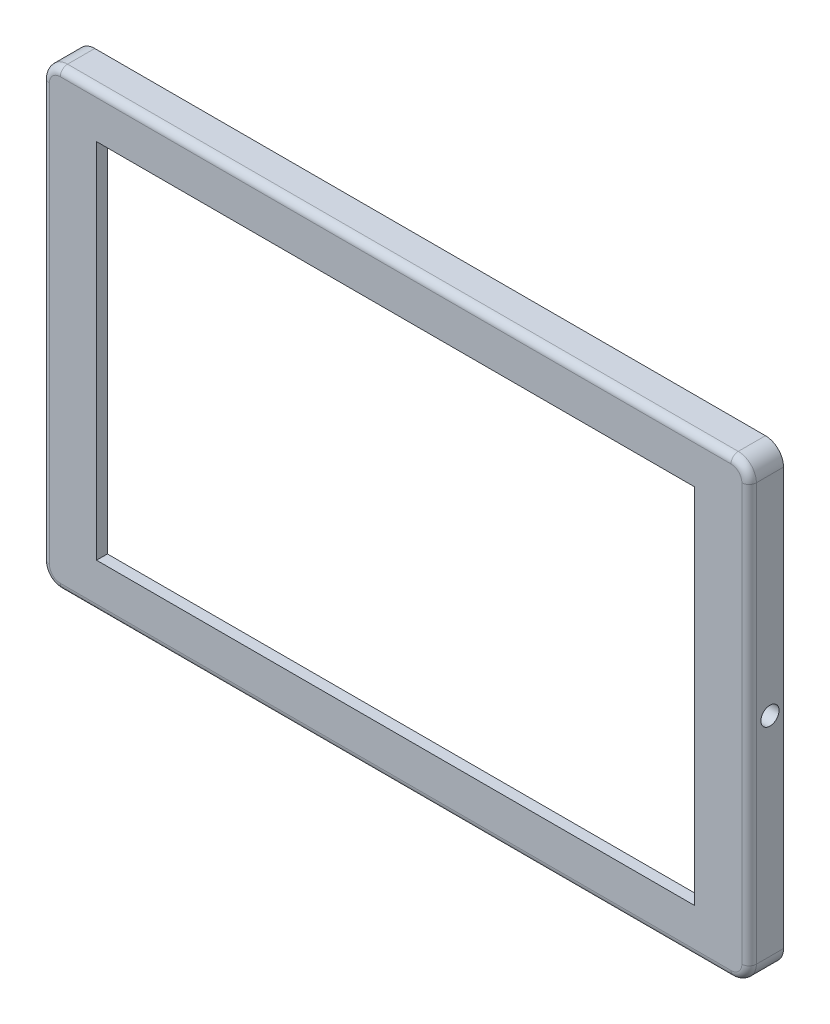
ISO-10303-21;
HEADER;
FILE_DESCRIPTION(('STEP AP214'),'2;1');
FILE_NAME('part.step','',(''),(''),'','','');
FILE_SCHEMA(('AUTOMOTIVE_DESIGN { 1 0 10303 214 1 1 1 1 }'));
ENDSEC;
DATA;
#1=APPLICATION_CONTEXT('core data for automotive mechanical design processes');
#2=APPLICATION_PROTOCOL_DEFINITION('international standard','automotive_design',2000,#1);
#3=PRODUCT_CONTEXT('',#1,'mechanical');
#4=PRODUCT('Part','Part','',(#3));
#5=PRODUCT_RELATED_PRODUCT_CATEGORY('part','',(#4));
#6=PRODUCT_DEFINITION_FORMATION('','',#4);
#7=PRODUCT_DEFINITION_CONTEXT('part definition',#1,'design');
#8=PRODUCT_DEFINITION('design','',#6,#7);
#9=PRODUCT_DEFINITION_SHAPE('','',#8);
#10=(LENGTH_UNIT() NAMED_UNIT(*) SI_UNIT(.MILLI.,.METRE.));
#11=(NAMED_UNIT(*) PLANE_ANGLE_UNIT() SI_UNIT($,.RADIAN.));
#12=(NAMED_UNIT(*) SI_UNIT($,.STERADIAN.) SOLID_ANGLE_UNIT());
#13=UNCERTAINTY_MEASURE_WITH_UNIT(LENGTH_MEASURE(1.E-05),#10,'distance_accuracy_value','');
#14=(GEOMETRIC_REPRESENTATION_CONTEXT(3) GLOBAL_UNCERTAINTY_ASSIGNED_CONTEXT((#13)) GLOBAL_UNIT_ASSIGNED_CONTEXT((#10,
#11,#12)) REPRESENTATION_CONTEXT('',''));
#15=CARTESIAN_POINT('',(0.,0.,0.));
#16=DIRECTION('',(0.,0.,1.));
#17=DIRECTION('',(1.,0.,0.));
#18=AXIS2_PLACEMENT_3D('',#15,#16,#17);
#19=CARTESIAN_POINT('',(-92.5000000000001,57.4999999999997,9.49999999999929));
#20=DIRECTION('',(1.,0.,0.));
#21=DIRECTION('',(0.,1.,0.));
#22=AXIS2_PLACEMENT_3D('',#19,#20,#21);
#23=PLANE('',#22);
#24=CARTESIAN_POINT('',(-92.5,-2.35922392732846E-13,3.74999999999936));
#25=DIRECTION('',(1.,0.,0.));
#26=DIRECTION('',(0.,1.,0.));
#27=AXIS2_PLACEMENT_3D('',#24,#25,#26);
#28=CIRCLE('',#27,2.5);
#29=CARTESIAN_POINT('',(-92.4999999999999,-2.50000000000023,3.75000000000015));
#30=VERTEX_POINT('',#29);
#31=EDGE_CURVE('E208',#30,#30,#28,.T.);
#32=ORIENTED_EDGE('',*,*,#31,.F.);
#33=EDGE_LOOP('',(#32));
#34=FACE_BOUND('',#33,.T.);
#35=DIRECTION('',(0.,0.,-1.));
#36=VECTOR('',#35,1.);
#37=CARTESIAN_POINT('',(-92.5000000000001,57.4999999999997,9.49999999999929));
#38=LINE('',#37,#36);
#39=CARTESIAN_POINT('',(-92.5000000000001,57.4999999999997,6.50000000000006));
#40=VERTEX_POINT('',#39);
#41=CARTESIAN_POINT('',(-92.4999999999999,57.4999999999997,0.));
#42=VERTEX_POINT('',#41);
#43=EDGE_CURVE('E244',#40,#42,#38,.T.);
#44=ORIENTED_EDGE('',*,*,#43,.F.);
#45=DIRECTION('',(0.,-1.,0.));
#46=VECTOR('',#45,1.);
#47=CARTESIAN_POINT('',(-92.5000000000001,57.4999999999997,6.50000000000006));
#48=LINE('',#47,#46);
#49=CARTESIAN_POINT('',(-92.5,-57.5000000000003,6.49999999999962));
#50=VERTEX_POINT('',#49);
#51=EDGE_CURVE('E229',#40,#50,#48,.T.);
#52=ORIENTED_EDGE('',*,*,#51,.T.);
#53=DIRECTION('',(0.,0.,-1.));
#54=VECTOR('',#53,1.);
#55=CARTESIAN_POINT('',(-92.5000000000001,-57.5000000000003,9.50000000000023));
#56=LINE('',#55,#54);
#57=CARTESIAN_POINT('',(-92.5000000000001,-57.5000000000004,-7.7715611723761E-13));
#58=VERTEX_POINT('',#57);
#59=EDGE_CURVE('E250',#50,#58,#56,.T.);
#60=ORIENTED_EDGE('',*,*,#59,.T.);
#61=DIRECTION('',(0.,-1.,0.));
#62=VECTOR('',#61,1.);
#63=CARTESIAN_POINT('',(-92.4999999999999,57.4999999999997,0.));
#64=LINE('',#63,#62);
#65=EDGE_CURVE('E232',#42,#58,#64,.T.);
#66=ORIENTED_EDGE('',*,*,#65,.F.);
#67=EDGE_LOOP('',(#44,#52,#60,#66));
#68=FACE_BOUND('',#67,.T.);
#69=ADVANCED_FACE('F39',(#34,#68),#23,.T.);
#70=CARTESIAN_POINT('',(-92.5000000000001,-57.5000000000003,9.50000000000023));
#71=DIRECTION('',(0.,1.,0.));
#72=DIRECTION('',(0.,0.,1.));
#73=AXIS2_PLACEMENT_3D('',#70,#71,#72);
#74=PLANE('',#73);
#75=ORIENTED_EDGE('',*,*,#59,.F.);
#76=DIRECTION('',(1.,0.,0.));
#77=VECTOR('',#76,1.);
#78=CARTESIAN_POINT('',(-92.5,-57.5000000000003,6.49999999999962));
#79=LINE('',#78,#77);
#80=CARTESIAN_POINT('',(92.4999999999998,-57.4999999999999,6.50000000000012));
#81=VERTEX_POINT('',#80);
#82=EDGE_CURVE('E226',#50,#81,#79,.T.);
#83=ORIENTED_EDGE('',*,*,#82,.T.);
#84=DIRECTION('',(0.,0.,-1.));
#85=VECTOR('',#84,1.);
#86=CARTESIAN_POINT('',(92.5,-57.5000000000001,9.50000000000023));
#87=LINE('',#86,#85);
#88=CARTESIAN_POINT('',(92.5,-57.5000000000001,0.));
#89=VERTEX_POINT('',#88);
#90=EDGE_CURVE('E248',#81,#89,#87,.T.);
#91=ORIENTED_EDGE('',*,*,#90,.T.);
#92=DIRECTION('',(1.,0.,0.));
#93=VECTOR('',#92,1.);
#94=CARTESIAN_POINT('',(-92.5000000000001,-57.5000000000004,-7.7715611723761E-13));
#95=LINE('',#94,#93);
#96=EDGE_CURVE('E235',#58,#89,#95,.T.);
#97=ORIENTED_EDGE('',*,*,#96,.F.);
#98=EDGE_LOOP('',(#75,#83,#91,#97));
#99=FACE_BOUND('',#98,.T.);
#100=ADVANCED_FACE('F422',(#99),#74,.T.);
#101=CARTESIAN_POINT('',(92.4999999999999,57.5000000000001,9.49999999999962));
#102=DIRECTION('',(-1.,0.,0.));
#103=DIRECTION('',(0.,-1.,0.));
#104=AXIS2_PLACEMENT_3D('',#101,#102,#103);
#105=PLANE('',#104);
#106=CARTESIAN_POINT('',(92.4999999999998,-4.57966997657877E-13,3.75000000000025));
#107=DIRECTION('',(-1.,0.,0.));
#108=DIRECTION('',(0.,-1.,0.));
#109=AXIS2_PLACEMENT_3D('',#106,#107,#108);
#110=CIRCLE('',#109,2.5);
#111=CARTESIAN_POINT('',(92.4999999999998,-2.50000000000021,3.75000000000014));
#112=VERTEX_POINT('',#111);
#113=EDGE_CURVE('E532',#112,#112,#110,.T.);
#114=ORIENTED_EDGE('',*,*,#113,.F.);
#115=EDGE_LOOP('',(#114));
#116=FACE_BOUND('',#115,.T.);
#117=ORIENTED_EDGE('',*,*,#90,.F.);
#118=DIRECTION('',(0.,1.,0.));
#119=VECTOR('',#118,1.);
#120=CARTESIAN_POINT('',(92.5,57.4999999999999,6.49999999999967));
#121=LINE('',#120,#119);
#122=CARTESIAN_POINT('',(92.5,57.4999999999999,6.49999999999967));
#123=VERTEX_POINT('',#122);
#124=EDGE_CURVE('E220',#81,#123,#121,.T.);
#125=ORIENTED_EDGE('',*,*,#124,.T.);
#126=DIRECTION('',(0.,0.,-1.));
#127=VECTOR('',#126,1.);
#128=CARTESIAN_POINT('',(92.4999999999999,57.5000000000001,9.49999999999962));
#129=LINE('',#128,#127);
#130=CARTESIAN_POINT('',(92.5,57.4999999999999,0.));
#131=VERTEX_POINT('',#130);
#132=EDGE_CURVE('E246',#123,#131,#129,.T.);
#133=ORIENTED_EDGE('',*,*,#132,.T.);
#134=DIRECTION('',(0.,1.,0.));
#135=VECTOR('',#134,1.);
#136=CARTESIAN_POINT('',(92.5,57.4999999999999,0.));
#137=LINE('',#136,#135);
#138=EDGE_CURVE('E238',#89,#131,#137,.T.);
#139=ORIENTED_EDGE('',*,*,#138,.F.);
#140=EDGE_LOOP('',(#117,#125,#133,#139));
#141=FACE_BOUND('',#140,.T.);
#142=ADVANCED_FACE('F429',(#116,#141),#105,.T.);
#143=CARTESIAN_POINT('',(-92.5000000000001,57.4999999999997,9.49999999999929));
#144=DIRECTION('',(0.,-1.,0.));
#145=DIRECTION('',(0.,0.,-1.));
#146=AXIS2_PLACEMENT_3D('',#143,#144,#145);
#147=PLANE('',#146);
#148=ORIENTED_EDGE('',*,*,#132,.F.);
#149=DIRECTION('',(-1.,0.,0.));
#150=VECTOR('',#149,1.);
#151=CARTESIAN_POINT('',(-92.5000000000001,57.4999999999997,6.50000000000006));
#152=LINE('',#151,#150);
#153=EDGE_CURVE('E264',#123,#40,#152,.T.);
#154=ORIENTED_EDGE('',*,*,#153,.T.);
#155=ORIENTED_EDGE('',*,*,#43,.T.);
#156=DIRECTION('',(-1.,0.,0.));
#157=VECTOR('',#156,1.);
#158=CARTESIAN_POINT('',(-92.4999999999999,57.4999999999997,0.));
#159=LINE('',#158,#157);
#160=EDGE_CURVE('E241',#131,#42,#159,.T.);
#161=ORIENTED_EDGE('',*,*,#160,.F.);
#162=EDGE_LOOP('',(#148,#154,#155,#161));
#163=FACE_BOUND('',#162,.T.);
#164=ADVANCED_FACE('F438',(#163),#147,.T.);
#165=CARTESIAN_POINT('',(-1.11022302462516E-13,-6.66133814775094E-13,9.49999999999934));
#166=DIRECTION('',(0.,0.,1.));
#167=DIRECTION('',(1.,0.,0.));
#168=AXIS2_PLACEMENT_3D('',#165,#166,#167);
#169=PLANE('',#168);
#170=CARTESIAN_POINT('',(92.4999999999999,57.5000000000001,9.49999999999962));
#171=DIRECTION('',(0.,0.,1.));
#172=DIRECTION('',(1.,0.,0.));
#173=AXIS2_PLACEMENT_3D('',#170,#171,#172);
#174=CIRCLE('',#173,3.);
#175=CARTESIAN_POINT('',(95.5,57.4999999999997,9.50000000000012));
#176=VERTEX_POINT('',#175);
#177=CARTESIAN_POINT('',(92.4999999999999,60.4999999999998,9.50000000000017));
#178=VERTEX_POINT('',#177);
#179=EDGE_CURVE('E306',#176,#178,#174,.T.);
#180=ORIENTED_EDGE('',*,*,#179,.T.);
#181=DIRECTION('',(-1.,0.,0.));
#182=VECTOR('',#181,1.);
#183=CARTESIAN_POINT('',(-92.4999999999999,60.4999999999998,9.49999999999929));
#184=LINE('',#183,#182);
#185=CARTESIAN_POINT('',(-92.4999999999999,60.4999999999998,9.49999999999929));
#186=VERTEX_POINT('',#185);
#187=EDGE_CURVE('E308',#178,#186,#184,.T.);
#188=ORIENTED_EDGE('',*,*,#187,.T.);
#189=CARTESIAN_POINT('',(-92.5000000000001,57.4999999999997,9.49999999999929));
#190=DIRECTION('',(0.,0.,1.));
#191=DIRECTION('',(1.,0.,0.));
#192=AXIS2_PLACEMENT_3D('',#189,#190,#191);
#193=CIRCLE('',#192,3.);
#194=CARTESIAN_POINT('',(-95.5000000000001,57.4999999999997,9.50000000000017));
#195=VERTEX_POINT('',#194);
#196=EDGE_CURVE('E294',#186,#195,#193,.T.);
#197=ORIENTED_EDGE('',*,*,#196,.T.);
#198=DIRECTION('',(0.,-1.,0.));
#199=VECTOR('',#198,1.);
#200=CARTESIAN_POINT('',(-95.5,-57.5000000000001,9.50000000000012));
#201=LINE('',#200,#199);
#202=CARTESIAN_POINT('',(-95.5,-57.5000000000001,9.50000000000012));
#203=VERTEX_POINT('',#202);
#204=EDGE_CURVE('E296',#195,#203,#201,.T.);
#205=ORIENTED_EDGE('',*,*,#204,.T.);
#206=CARTESIAN_POINT('',(-92.5000000000001,-57.5000000000003,9.50000000000023));
#207=DIRECTION('',(0.,0.,1.));
#208=DIRECTION('',(1.,0.,0.));
#209=AXIS2_PLACEMENT_3D('',#206,#207,#208);
#210=CIRCLE('',#209,3.);
#211=CARTESIAN_POINT('',(-92.5,-60.5000000000002,9.50000000000012));
#212=VERTEX_POINT('',#211);
#213=EDGE_CURVE('E298',#203,#212,#210,.T.);
#214=ORIENTED_EDGE('',*,*,#213,.T.);
#215=DIRECTION('',(1.,0.,0.));
#216=VECTOR('',#215,1.);
#217=CARTESIAN_POINT('',(92.5,-60.5000000000003,9.49999999999929));
#218=LINE('',#217,#216);
#219=CARTESIAN_POINT('',(92.5,-60.5000000000003,9.49999999999929));
#220=VERTEX_POINT('',#219);
#221=EDGE_CURVE('E300',#212,#220,#218,.T.);
#222=ORIENTED_EDGE('',*,*,#221,.T.);
#223=CARTESIAN_POINT('',(92.5,-57.5000000000001,9.50000000000023));
#224=DIRECTION('',(0.,0.,1.));
#225=DIRECTION('',(1.,0.,0.));
#226=AXIS2_PLACEMENT_3D('',#223,#224,#225);
#227=CIRCLE('',#226,3.);
#228=CARTESIAN_POINT('',(95.4999999999999,-57.5000000000003,9.50000000000017));
#229=VERTEX_POINT('',#228);
#230=EDGE_CURVE('E302',#220,#229,#227,.T.);
#231=ORIENTED_EDGE('',*,*,#230,.T.);
#232=DIRECTION('',(0.,1.,0.));
#233=VECTOR('',#232,1.);
#234=CARTESIAN_POINT('',(95.5,57.4999999999997,9.50000000000012));
#235=LINE('',#234,#233);
#236=EDGE_CURVE('E304',#229,#176,#235,.T.);
#237=ORIENTED_EDGE('',*,*,#236,.T.);
#238=EDGE_LOOP('',(#180,#188,#197,#205,#214,#222,#231,#237));
#239=FACE_BOUND('',#238,.T.);
#240=DIRECTION('',(0.,-1.,0.));
#241=VECTOR('',#240,1.);
#242=CARTESIAN_POINT('',(-82.5000000000002,50.0000000000003,9.49999999999929));
#243=LINE('',#242,#241);
#244=CARTESIAN_POINT('',(-82.5000000000002,50.0000000000003,9.49999999999929));
#245=VERTEX_POINT('',#244);
#246=CARTESIAN_POINT('',(-82.5000000000001,-50.0000000000001,9.49999999999918));
#247=VERTEX_POINT('',#246);
#248=EDGE_CURVE('E185',#245,#247,#243,.T.);
#249=ORIENTED_EDGE('',*,*,#248,.F.);
#250=DIRECTION('',(-1.,0.,0.));
#251=VECTOR('',#250,1.);
#252=CARTESIAN_POINT('',(-82.5000000000002,50.0000000000003,9.49999999999929));
#253=LINE('',#252,#251);
#254=CARTESIAN_POINT('',(82.4999999999998,49.9999999999998,9.50000000000017));
#255=VERTEX_POINT('',#254);
#256=EDGE_CURVE('E202',#255,#245,#253,.T.);
#257=ORIENTED_EDGE('',*,*,#256,.F.);
#258=DIRECTION('',(0.,1.,0.));
#259=VECTOR('',#258,1.);
#260=CARTESIAN_POINT('',(82.4999999999998,49.9999999999998,9.50000000000017));
#261=LINE('',#260,#259);
#262=CARTESIAN_POINT('',(82.4999999999999,-50.0000000000003,9.49999999999973));
#263=VERTEX_POINT('',#262);
#264=EDGE_CURVE('E205',#263,#255,#261,.T.);
#265=ORIENTED_EDGE('',*,*,#264,.F.);
#266=DIRECTION('',(1.,0.,0.));
#267=VECTOR('',#266,1.);
#268=CARTESIAN_POINT('',(-82.5000000000001,-50.0000000000001,9.49999999999918));
#269=LINE('',#268,#267);
#270=EDGE_CURVE('E214',#247,#263,#269,.T.);
#271=ORIENTED_EDGE('',*,*,#270,.F.);
#272=EDGE_LOOP('',(#249,#257,#265,#271));
#273=FACE_BOUND('',#272,.T.);
#274=ADVANCED_FACE('F384',(#239,#273),#169,.T.);
#275=CARTESIAN_POINT('',(0.,0.,0.));
#276=DIRECTION('',(0.,0.,1.));
#277=DIRECTION('',(1.,0.,0.));
#278=AXIS2_PLACEMENT_3D('',#275,#276,#277);
#279=PLANE('',#278);
#280=DIRECTION('',(1.,0.,0.));
#281=VECTOR('',#280,1.);
#282=CARTESIAN_POINT('',(-97.5000000000002,-62.5000000000003,-7.7715611723761E-13));
#283=LINE('',#282,#281);
#284=CARTESIAN_POINT('',(-92.5,-62.5000000000004,1.11022302462516E-13));
#285=VERTEX_POINT('',#284);
#286=CARTESIAN_POINT('',(92.4999999999997,-62.5000000000002,0.));
#287=VERTEX_POINT('',#286);
#288=EDGE_CURVE('E255',#285,#287,#283,.T.);
#289=ORIENTED_EDGE('',*,*,#288,.F.);
#290=CARTESIAN_POINT('',(-92.5000000000001,-57.5000000000004,-7.7715611723761E-13));
#291=DIRECTION('',(0.,0.,1.));
#292=DIRECTION('',(1.,0.,0.));
#293=AXIS2_PLACEMENT_3D('',#290,#291,#292);
#294=CIRCLE('',#293,5.);
#295=CARTESIAN_POINT('',(-97.5000000000001,-57.4999999999999,1.11022302462516E-13));
#296=VERTEX_POINT('',#295);
#297=EDGE_CURVE('E278',#285,#296,#294,.F.);
#298=ORIENTED_EDGE('',*,*,#297,.T.);
#299=DIRECTION('',(0.,-1.,0.));
#300=VECTOR('',#299,1.);
#301=CARTESIAN_POINT('',(-97.5000000000001,62.5,0.));
#302=LINE('',#301,#300);
#303=CARTESIAN_POINT('',(-97.5000000000002,57.4999999999999,-8.32667268468867E-13));
#304=VERTEX_POINT('',#303);
#305=EDGE_CURVE('E252',#304,#296,#302,.T.);
#306=ORIENTED_EDGE('',*,*,#305,.F.);
#307=CARTESIAN_POINT('',(-92.4999999999999,57.4999999999997,0.));
#308=DIRECTION('',(0.,0.,1.));
#309=DIRECTION('',(1.,0.,0.));
#310=AXIS2_PLACEMENT_3D('',#307,#308,#309);
#311=CIRCLE('',#310,5.);
#312=CARTESIAN_POINT('',(-92.4999999999999,62.4999999999998,0.));
#313=VERTEX_POINT('',#312);
#314=EDGE_CURVE('E272',#304,#313,#311,.F.);
#315=ORIENTED_EDGE('',*,*,#314,.T.);
#316=DIRECTION('',(-1.,0.,0.));
#317=VECTOR('',#316,1.);
#318=CARTESIAN_POINT('',(-97.5000000000001,62.5,0.));
#319=LINE('',#318,#317);
#320=CARTESIAN_POINT('',(92.4999999999998,62.5,1.11022302462516E-13));
#321=VERTEX_POINT('',#320);
#322=EDGE_CURVE('E261',#321,#313,#319,.T.);
#323=ORIENTED_EDGE('',*,*,#322,.F.);
#324=CARTESIAN_POINT('',(92.5,57.4999999999999,0.));
#325=DIRECTION('',(0.,0.,1.));
#326=DIRECTION('',(1.,0.,0.));
#327=AXIS2_PLACEMENT_3D('',#324,#325,#326);
#328=CIRCLE('',#327,5.);
#329=CARTESIAN_POINT('',(97.5,57.4999999999997,0.));
#330=VERTEX_POINT('',#329);
#331=EDGE_CURVE('E274',#321,#330,#328,.F.);
#332=ORIENTED_EDGE('',*,*,#331,.T.);
#333=DIRECTION('',(0.,1.,0.));
#334=VECTOR('',#333,1.);
#335=CARTESIAN_POINT('',(97.5,62.5,2.22044604925031E-13));
#336=LINE('',#335,#334);
#337=CARTESIAN_POINT('',(97.4999999999998,-57.5000000000003,0.));
#338=VERTEX_POINT('',#337);
#339=EDGE_CURVE('E258',#338,#330,#336,.T.);
#340=ORIENTED_EDGE('',*,*,#339,.F.);
#341=CARTESIAN_POINT('',(92.5,-57.5000000000001,0.));
#342=DIRECTION('',(0.,0.,1.));
#343=DIRECTION('',(1.,0.,0.));
#344=AXIS2_PLACEMENT_3D('',#341,#342,#343);
#345=CIRCLE('',#344,5.);
#346=EDGE_CURVE('E276',#338,#287,#345,.F.);
#347=ORIENTED_EDGE('',*,*,#346,.T.);
#348=EDGE_LOOP('',(#289,#298,#306,#315,#323,#332,#340,#347));
#349=FACE_BOUND('',#348,.T.);
#350=ORIENTED_EDGE('',*,*,#65,.T.);
#351=ORIENTED_EDGE('',*,*,#96,.T.);
#352=ORIENTED_EDGE('',*,*,#138,.T.);
#353=ORIENTED_EDGE('',*,*,#160,.T.);
#354=EDGE_LOOP('',(#350,#351,#352,#353));
#355=FACE_BOUND('',#354,.T.);
#356=ADVANCED_FACE('F362',(#349,#355),#279,.F.);
#357=CARTESIAN_POINT('',(-97.4999999999999,62.5000000000002,9.50000000000012));
#358=DIRECTION('',(1.,0.,0.));
#359=DIRECTION('',(0.,1.,0.));
#360=AXIS2_PLACEMENT_3D('',#357,#358,#359);
#361=PLANE('',#360);
#362=CARTESIAN_POINT('',(-97.5000000000002,0.,3.74999999999925));
#363=DIRECTION('',(-1.,0.,0.));
#364=DIRECTION('',(0.,-1.,0.));
#365=AXIS2_PLACEMENT_3D('',#362,#363,#364);
#366=CIRCLE('',#365,2.5);
#367=CARTESIAN_POINT('',(-97.5000000000002,-2.50000000000023,3.75000000000015));
#368=VERTEX_POINT('',#367);
#369=EDGE_CURVE('E543',#368,#368,#366,.T.);
#370=ORIENTED_EDGE('',*,*,#369,.F.);
#371=EDGE_LOOP('',(#370));
#372=FACE_BOUND('',#371,.T.);
#373=DIRECTION('',(0.,0.,-1.));
#374=VECTOR('',#373,1.);
#375=CARTESIAN_POINT('',(-97.5,-57.5000000000003,9.49999999999929));
#376=LINE('',#375,#374);
#377=CARTESIAN_POINT('',(-97.5000000000002,-57.5000000000004,7.4999999999999));
#378=VERTEX_POINT('',#377);
#379=EDGE_CURVE('E282',#296,#378,#376,.F.);
#380=ORIENTED_EDGE('',*,*,#379,.T.);
#381=DIRECTION('',(0.,-1.,0.));
#382=VECTOR('',#381,1.);
#383=CARTESIAN_POINT('',(-97.5,57.4999999999995,7.49999999999901));
#384=LINE('',#383,#382);
#385=CARTESIAN_POINT('',(-97.5,57.4999999999995,7.49999999999901));
#386=VERTEX_POINT('',#385);
#387=EDGE_CURVE('E48',#378,#386,#384,.F.);
#388=ORIENTED_EDGE('',*,*,#387,.T.);
#389=DIRECTION('',(0.,0.,-1.));
#390=VECTOR('',#389,1.);
#391=CARTESIAN_POINT('',(-97.5,57.4999999999999,9.49999999999923));
#392=LINE('',#391,#390);
#393=EDGE_CURVE('E280',#386,#304,#392,.T.);
#394=ORIENTED_EDGE('',*,*,#393,.T.);
#395=ORIENTED_EDGE('',*,*,#305,.T.);
#396=EDGE_LOOP('',(#380,#388,#394,#395));
#397=FACE_BOUND('',#396,.T.);
#398=ADVANCED_FACE('F441',(#372,#397),#361,.F.);
#399=CARTESIAN_POINT('',(-97.5000000000001,-62.5000000000002,9.49999999999929));
#400=DIRECTION('',(0.,1.,0.));
#401=DIRECTION('',(0.,0.,1.));
#402=AXIS2_PLACEMENT_3D('',#399,#400,#401);
#403=PLANE('',#402);
#404=DIRECTION('',(0.,0.,-1.));
#405=VECTOR('',#404,1.);
#406=CARTESIAN_POINT('',(92.4999999999999,-62.5000000000007,9.50000000000017));
#407=LINE('',#406,#405);
#408=CARTESIAN_POINT('',(92.4999999999999,-62.5000000000004,7.4999999999999));
#409=VERTEX_POINT('',#408);
#410=EDGE_CURVE('E267',#287,#409,#407,.F.);
#411=ORIENTED_EDGE('',*,*,#410,.T.);
#412=DIRECTION('',(1.,0.,0.));
#413=VECTOR('',#412,1.);
#414=CARTESIAN_POINT('',(-92.5000000000001,-62.5000000000003,7.49999999999912));
#415=LINE('',#414,#413);
#416=CARTESIAN_POINT('',(-92.5000000000001,-62.5000000000003,7.49999999999912));
#417=VERTEX_POINT('',#416);
#418=EDGE_CURVE('E320',#409,#417,#415,.F.);
#419=ORIENTED_EDGE('',*,*,#418,.T.);
#420=DIRECTION('',(0.,0.,-1.));
#421=VECTOR('',#420,1.);
#422=CARTESIAN_POINT('',(-92.5000000000001,-62.5000000000005,9.49999999999929));
#423=LINE('',#422,#421);
#424=EDGE_CURVE('E270',#417,#285,#423,.T.);
#425=ORIENTED_EDGE('',*,*,#424,.T.);
#426=ORIENTED_EDGE('',*,*,#288,.T.);
#427=EDGE_LOOP('',(#411,#419,#425,#426));
#428=FACE_BOUND('',#427,.T.);
#429=ADVANCED_FACE('F355',(#428),#403,.F.);
#430=CARTESIAN_POINT('',(97.4999999999999,62.4999999999998,9.49999999999979));
#431=DIRECTION('',(-1.,0.,0.));
#432=DIRECTION('',(0.,-1.,0.));
#433=AXIS2_PLACEMENT_3D('',#430,#431,#432);
#434=PLANE('',#433);
#435=CARTESIAN_POINT('',(97.5,-2.08166817117217E-13,3.75000000000014));
#436=DIRECTION('',(-1.,0.,0.));
#437=DIRECTION('',(0.,-1.,0.));
#438=AXIS2_PLACEMENT_3D('',#435,#436,#437);
#439=CIRCLE('',#438,2.5);
#440=CARTESIAN_POINT('',(97.5,-2.50000000000021,3.75000000000014));
#441=VERTEX_POINT('',#440);
#442=EDGE_CURVE('E541',#441,#441,#439,.T.);
#443=ORIENTED_EDGE('',*,*,#442,.T.);
#444=EDGE_LOOP('',(#443));
#445=FACE_BOUND('',#444,.T.);
#446=DIRECTION('',(0.,0.,-1.));
#447=VECTOR('',#446,1.);
#448=CARTESIAN_POINT('',(97.4999999999999,57.4999999999999,9.50000000000017));
#449=LINE('',#448,#447);
#450=CARTESIAN_POINT('',(97.4999999999998,57.4999999999997,7.49999999999951));
#451=VERTEX_POINT('',#450);
#452=EDGE_CURVE('E284',#330,#451,#449,.F.);
#453=ORIENTED_EDGE('',*,*,#452,.T.);
#454=DIRECTION('',(0.,1.,0.));
#455=VECTOR('',#454,1.);
#456=CARTESIAN_POINT('',(97.5000000000001,-57.5000000000005,7.50000000000034));
#457=LINE('',#456,#455);
#458=CARTESIAN_POINT('',(97.5000000000001,-57.5000000000005,7.50000000000034));
#459=VERTEX_POINT('',#458);
#460=EDGE_CURVE('E316',#451,#459,#457,.F.);
#461=ORIENTED_EDGE('',*,*,#460,.T.);
#462=DIRECTION('',(0.,0.,-1.));
#463=VECTOR('',#462,1.);
#464=CARTESIAN_POINT('',(97.5000000000001,-57.5000000000001,9.50000000000006));
#465=LINE('',#464,#463);
#466=EDGE_CURVE('E287',#459,#338,#465,.T.);
#467=ORIENTED_EDGE('',*,*,#466,.T.);
#468=ORIENTED_EDGE('',*,*,#339,.T.);
#469=EDGE_LOOP('',(#453,#461,#467,#468));
#470=FACE_BOUND('',#469,.T.);
#471=ADVANCED_FACE('F370',(#445,#470),#434,.F.);
#472=CARTESIAN_POINT('',(-97.4999999999999,62.5000000000002,9.50000000000012));
#473=DIRECTION('',(0.,-1.,0.));
#474=DIRECTION('',(0.,0.,-1.));
#475=AXIS2_PLACEMENT_3D('',#472,#473,#474);
#476=PLANE('',#475);
#477=DIRECTION('',(0.,0.,-1.));
#478=VECTOR('',#477,1.);
#479=CARTESIAN_POINT('',(-92.5000000000001,62.4999999999998,9.50000000000017));
#480=LINE('',#479,#478);
#481=CARTESIAN_POINT('',(-92.5,62.4999999999998,7.49999999999995));
#482=VERTEX_POINT('',#481);
#483=EDGE_CURVE('E289',#313,#482,#480,.F.);
#484=ORIENTED_EDGE('',*,*,#483,.T.);
#485=DIRECTION('',(-1.,0.,0.));
#486=VECTOR('',#485,1.);
#487=CARTESIAN_POINT('',(92.4999999999999,62.5,7.49999999999951));
#488=LINE('',#487,#486);
#489=CARTESIAN_POINT('',(92.4999999999999,62.5,7.49999999999951));
#490=VERTEX_POINT('',#489);
#491=EDGE_CURVE('E311',#482,#490,#488,.F.);
#492=ORIENTED_EDGE('',*,*,#491,.T.);
#493=DIRECTION('',(0.,0.,-1.));
#494=VECTOR('',#493,1.);
#495=CARTESIAN_POINT('',(92.5,62.4999999999996,9.49999999999929));
#496=LINE('',#495,#494);
#497=EDGE_CURVE('E292',#490,#321,#496,.T.);
#498=ORIENTED_EDGE('',*,*,#497,.T.);
#499=ORIENTED_EDGE('',*,*,#322,.T.);
#500=EDGE_LOOP('',(#484,#492,#498,#499));
#501=FACE_BOUND('',#500,.T.);
#502=ADVANCED_FACE('F403',(#501),#476,.F.);
#503=CARTESIAN_POINT('',(0.,-2.08166817117217E-13,6.49999999999917));
#504=DIRECTION('',(0.,0.,1.));
#505=DIRECTION('',(1.,0.,0.));
#506=AXIS2_PLACEMENT_3D('',#503,#504,#505);
#507=PLANE('',#506);
#508=ORIENTED_EDGE('',*,*,#51,.F.);
#509=ORIENTED_EDGE('',*,*,#153,.F.);
#510=ORIENTED_EDGE('',*,*,#124,.F.);
#511=ORIENTED_EDGE('',*,*,#82,.F.);
#512=EDGE_LOOP('',(#508,#509,#510,#511));
#513=FACE_BOUND('',#512,.T.);
#514=DIRECTION('',(-1.,0.,0.));
#515=VECTOR('',#514,1.);
#516=CARTESIAN_POINT('',(-82.5000000000003,50.0000000000003,6.49999999999995));
#517=LINE('',#516,#515);
#518=CARTESIAN_POINT('',(82.4999999999998,50.,6.49999999999906));
#519=VERTEX_POINT('',#518);
#520=CARTESIAN_POINT('',(-82.5000000000003,50.0000000000003,6.49999999999995));
#521=VERTEX_POINT('',#520);
#522=EDGE_CURVE('E190',#519,#521,#517,.T.);
#523=ORIENTED_EDGE('',*,*,#522,.T.);
#524=DIRECTION('',(0.,-1.,0.));
#525=VECTOR('',#524,1.);
#526=CARTESIAN_POINT('',(-82.5000000000003,50.0000000000003,6.49999999999995));
#527=LINE('',#526,#525);
#528=CARTESIAN_POINT('',(-82.5000000000001,-50.0000000000005,6.50000000000001));
#529=VERTEX_POINT('',#528);
#530=EDGE_CURVE('E182',#521,#529,#527,.T.);
#531=ORIENTED_EDGE('',*,*,#530,.T.);
#532=DIRECTION('',(1.,0.,0.));
#533=VECTOR('',#532,1.);
#534=CARTESIAN_POINT('',(-82.5000000000001,-50.0000000000005,6.50000000000001));
#535=LINE('',#534,#533);
#536=CARTESIAN_POINT('',(82.4999999999999,-50.0000000000003,6.50000000000006));
#537=VERTEX_POINT('',#536);
#538=EDGE_CURVE('E194',#529,#537,#535,.T.);
#539=ORIENTED_EDGE('',*,*,#538,.T.);
#540=DIRECTION('',(0.,1.,0.));
#541=VECTOR('',#540,1.);
#542=CARTESIAN_POINT('',(82.4999999999998,50.,6.49999999999906));
#543=LINE('',#542,#541);
#544=EDGE_CURVE('E198',#537,#519,#543,.T.);
#545=ORIENTED_EDGE('',*,*,#544,.T.);
#546=EDGE_LOOP('',(#523,#531,#539,#545));
#547=FACE_BOUND('',#546,.T.);
#548=ADVANCED_FACE('F200',(#513,#547),#507,.F.);
#549=CARTESIAN_POINT('',(-82.5000000000003,50.0000000000003,6.49999999999995));
#550=DIRECTION('',(-1.,0.,0.));
#551=DIRECTION('',(0.,-1.,0.));
#552=AXIS2_PLACEMENT_3D('',#549,#550,#551);
#553=PLANE('',#552);
#554=ORIENTED_EDGE('',*,*,#248,.T.);
#555=DIRECTION('',(0.,0.,1.));
#556=VECTOR('',#555,1.);
#557=CARTESIAN_POINT('',(-82.5000000000001,-50.0000000000005,6.50000000000001));
#558=LINE('',#557,#556);
#559=EDGE_CURVE('E178',#529,#247,#558,.T.);
#560=ORIENTED_EDGE('',*,*,#559,.F.);
#561=ORIENTED_EDGE('',*,*,#530,.F.);
#562=DIRECTION('',(0.,0.,1.));
#563=VECTOR('',#562,1.);
#564=CARTESIAN_POINT('',(-82.5000000000003,50.0000000000003,6.49999999999995));
#565=LINE('',#564,#563);
#566=EDGE_CURVE('E218',#521,#245,#565,.T.);
#567=ORIENTED_EDGE('',*,*,#566,.T.);
#568=EDGE_LOOP('',(#554,#560,#561,#567));
#569=FACE_BOUND('',#568,.T.);
#570=ADVANCED_FACE('F180',(#569),#553,.F.);
#571=CARTESIAN_POINT('',(-82.5000000000003,50.0000000000003,6.49999999999995));
#572=DIRECTION('',(0.,1.,0.));
#573=DIRECTION('',(0.,0.,1.));
#574=AXIS2_PLACEMENT_3D('',#571,#572,#573);
#575=PLANE('',#574);
#576=ORIENTED_EDGE('',*,*,#256,.T.);
#577=ORIENTED_EDGE('',*,*,#566,.F.);
#578=ORIENTED_EDGE('',*,*,#522,.F.);
#579=DIRECTION('',(0.,0.,1.));
#580=VECTOR('',#579,1.);
#581=CARTESIAN_POINT('',(82.4999999999998,50.,6.49999999999906));
#582=LINE('',#581,#580);
#583=EDGE_CURVE('E221',#519,#255,#582,.T.);
#584=ORIENTED_EDGE('',*,*,#583,.T.);
#585=EDGE_LOOP('',(#576,#577,#578,#584));
#586=FACE_BOUND('',#585,.T.);
#587=ADVANCED_FACE('F508',(#586),#575,.F.);
#588=CARTESIAN_POINT('',(82.4999999999998,50.,6.49999999999906));
#589=DIRECTION('',(1.,0.,0.));
#590=DIRECTION('',(0.,1.,0.));
#591=AXIS2_PLACEMENT_3D('',#588,#589,#590);
#592=PLANE('',#591);
#593=ORIENTED_EDGE('',*,*,#264,.T.);
#594=ORIENTED_EDGE('',*,*,#583,.F.);
#595=ORIENTED_EDGE('',*,*,#544,.F.);
#596=DIRECTION('',(0.,0.,1.));
#597=VECTOR('',#596,1.);
#598=CARTESIAN_POINT('',(82.4999999999999,-50.0000000000003,6.50000000000006));
#599=LINE('',#598,#597);
#600=EDGE_CURVE('E189',#537,#263,#599,.T.);
#601=ORIENTED_EDGE('',*,*,#600,.T.);
#602=EDGE_LOOP('',(#593,#594,#595,#601));
#603=FACE_BOUND('',#602,.T.);
#604=ADVANCED_FACE('F511',(#603),#592,.F.);
#605=CARTESIAN_POINT('',(-82.5000000000001,-50.0000000000005,6.50000000000001));
#606=DIRECTION('',(0.,-1.,0.));
#607=DIRECTION('',(0.,0.,-1.));
#608=AXIS2_PLACEMENT_3D('',#605,#606,#607);
#609=PLANE('',#608);
#610=ORIENTED_EDGE('',*,*,#270,.T.);
#611=ORIENTED_EDGE('',*,*,#600,.F.);
#612=ORIENTED_EDGE('',*,*,#538,.F.);
#613=ORIENTED_EDGE('',*,*,#559,.T.);
#614=EDGE_LOOP('',(#610,#611,#612,#613));
#615=FACE_BOUND('',#614,.T.);
#616=ADVANCED_FACE('F195',(#615),#609,.F.);
#617=CARTESIAN_POINT('',(-92.5000000000001,-57.5000000000003,9.50000000000023));
#618=DIRECTION('',(0.,0.,-1.));
#619=DIRECTION('',(-1.,0.,0.));
#620=AXIS2_PLACEMENT_3D('',#617,#618,#619);
#621=CYLINDRICAL_SURFACE('',#620,5.);
#622=ORIENTED_EDGE('',*,*,#424,.F.);
#623=CARTESIAN_POINT('',(-92.5,-57.5000000000005,7.49999999999984));
#624=DIRECTION('',(0.,0.,1.));
#625=DIRECTION('',(1.,0.,0.));
#626=AXIS2_PLACEMENT_3D('',#623,#624,#625);
#627=CIRCLE('',#626,5.);
#628=EDGE_CURVE('E63',#417,#378,#627,.F.);
#629=ORIENTED_EDGE('',*,*,#628,.T.);
#630=ORIENTED_EDGE('',*,*,#379,.F.);
#631=ORIENTED_EDGE('',*,*,#297,.F.);
#632=EDGE_LOOP('',(#622,#629,#630,#631));
#633=FACE_BOUND('',#632,.T.);
#634=ADVANCED_FACE('F358',(#633),#621,.T.);
#635=CARTESIAN_POINT('',(92.5,-57.5000000000001,9.50000000000023));
#636=DIRECTION('',(0.,0.,-1.));
#637=DIRECTION('',(-1.,0.,0.));
#638=AXIS2_PLACEMENT_3D('',#635,#636,#637);
#639=CYLINDRICAL_SURFACE('',#638,5.);
#640=ORIENTED_EDGE('',*,*,#466,.F.);
#641=CARTESIAN_POINT('',(92.5,-57.5000000000001,7.4999999999994));
#642=DIRECTION('',(0.,0.,1.));
#643=DIRECTION('',(1.,0.,0.));
#644=AXIS2_PLACEMENT_3D('',#641,#642,#643);
#645=CIRCLE('',#644,5.);
#646=EDGE_CURVE('E318',#459,#409,#645,.F.);
#647=ORIENTED_EDGE('',*,*,#646,.T.);
#648=ORIENTED_EDGE('',*,*,#410,.F.);
#649=ORIENTED_EDGE('',*,*,#346,.F.);
#650=EDGE_LOOP('',(#640,#647,#648,#649));
#651=FACE_BOUND('',#650,.T.);
#652=ADVANCED_FACE('F368',(#651),#639,.T.);
#653=CARTESIAN_POINT('',(92.4999999999999,57.5000000000001,9.49999999999962));
#654=DIRECTION('',(0.,0.,-1.));
#655=DIRECTION('',(-1.,0.,0.));
#656=AXIS2_PLACEMENT_3D('',#653,#654,#655);
#657=CYLINDRICAL_SURFACE('',#656,5.);
#658=ORIENTED_EDGE('',*,*,#497,.F.);
#659=CARTESIAN_POINT('',(92.4999999999999,57.4999999999997,7.49999999999995));
#660=DIRECTION('',(0.,0.,1.));
#661=DIRECTION('',(1.,0.,0.));
#662=AXIS2_PLACEMENT_3D('',#659,#660,#661);
#663=CIRCLE('',#662,5.);
#664=EDGE_CURVE('E314',#490,#451,#663,.F.);
#665=ORIENTED_EDGE('',*,*,#664,.T.);
#666=ORIENTED_EDGE('',*,*,#452,.F.);
#667=ORIENTED_EDGE('',*,*,#331,.F.);
#668=EDGE_LOOP('',(#658,#665,#666,#667));
#669=FACE_BOUND('',#668,.T.);
#670=ADVANCED_FACE('F456',(#669),#657,.T.);
#671=CARTESIAN_POINT('',(-92.5000000000001,57.4999999999997,9.49999999999929));
#672=DIRECTION('',(0.,0.,-1.));
#673=DIRECTION('',(-1.,0.,0.));
#674=AXIS2_PLACEMENT_3D('',#671,#672,#673);
#675=CYLINDRICAL_SURFACE('',#674,5.);
#676=ORIENTED_EDGE('',*,*,#393,.F.);
#677=CARTESIAN_POINT('',(-92.5,57.4999999999999,7.49999999999906));
#678=DIRECTION('',(0.,0.,1.));
#679=DIRECTION('',(1.,0.,0.));
#680=AXIS2_PLACEMENT_3D('',#677,#678,#679);
#681=CIRCLE('',#680,5.);
#682=EDGE_CURVE('E11',#386,#482,#681,.F.);
#683=ORIENTED_EDGE('',*,*,#682,.T.);
#684=ORIENTED_EDGE('',*,*,#483,.F.);
#685=ORIENTED_EDGE('',*,*,#314,.F.);
#686=EDGE_LOOP('',(#676,#683,#684,#685));
#687=FACE_BOUND('',#686,.T.);
#688=ADVANCED_FACE('F399',(#687),#675,.T.);
#689=CARTESIAN_POINT('',(1.11022302462516E-13,-60.5000000000002,7.49999999999951));
#690=DIRECTION('',(-1.,0.,0.));
#691=DIRECTION('',(0.,0.,1.));
#692=AXIS2_PLACEMENT_3D('',#689,#690,#691);
#693=CYLINDRICAL_SURFACE('',#692,2.);
#694=CARTESIAN_POINT('',(-92.5000000000001,-60.5,7.50000000000001));
#695=DIRECTION('',(-1.,0.,0.));
#696=DIRECTION('',(0.,0.,1.));
#697=AXIS2_PLACEMENT_3D('',#694,#695,#696);
#698=CIRCLE('',#697,2.);
#699=EDGE_CURVE('E339',#417,#212,#698,.T.);
#700=ORIENTED_EDGE('',*,*,#699,.F.);
#701=ORIENTED_EDGE('',*,*,#418,.F.);
#702=CARTESIAN_POINT('',(92.4999999999999,-60.5000000000004,7.49999999999951));
#703=DIRECTION('',(1.,0.,0.));
#704=DIRECTION('',(0.,0.,-1.));
#705=AXIS2_PLACEMENT_3D('',#702,#703,#704);
#706=CIRCLE('',#705,2.);
#707=EDGE_CURVE('E43',#220,#409,#706,.T.);
#708=ORIENTED_EDGE('',*,*,#707,.F.);
#709=ORIENTED_EDGE('',*,*,#221,.F.);
#710=EDGE_LOOP('',(#700,#701,#708,#709));
#711=FACE_BOUND('',#710,.T.);
#712=ADVANCED_FACE('F41',(#711),#693,.T.);
#713=CARTESIAN_POINT('',(92.5,-57.5000000000001,7.4999999999994));
#714=DIRECTION('',(0.,0.,1.));
#715=DIRECTION('',(1.,0.,0.));
#716=AXIS2_PLACEMENT_3D('',#713,#714,#715);
#717=TOROIDAL_SURFACE('',#716,3.,2.);
#718=ORIENTED_EDGE('',*,*,#707,.T.);
#719=ORIENTED_EDGE('',*,*,#646,.F.);
#720=CARTESIAN_POINT('',(95.4999999999999,-57.5000000000005,7.49999999999962));
#721=DIRECTION('',(0.,1.,0.));
#722=DIRECTION('',(0.,0.,1.));
#723=AXIS2_PLACEMENT_3D('',#720,#721,#722);
#724=CIRCLE('',#723,2.);
#725=EDGE_CURVE('E337',#229,#459,#724,.T.);
#726=ORIENTED_EDGE('',*,*,#725,.F.);
#727=ORIENTED_EDGE('',*,*,#230,.F.);
#728=EDGE_LOOP('',(#718,#719,#726,#727));
#729=FACE_BOUND('',#728,.T.);
#730=ADVANCED_FACE('F349',(#729),#717,.T.);
#731=CARTESIAN_POINT('',(-92.5,-57.5000000000005,7.49999999999984));
#732=DIRECTION('',(0.,0.,1.));
#733=DIRECTION('',(1.,0.,0.));
#734=AXIS2_PLACEMENT_3D('',#731,#732,#733);
#735=TOROIDAL_SURFACE('',#734,3.,2.);
#736=ORIENTED_EDGE('',*,*,#699,.T.);
#737=ORIENTED_EDGE('',*,*,#213,.F.);
#738=CARTESIAN_POINT('',(-95.5000000000001,-57.5000000000005,7.49999999999951));
#739=DIRECTION('',(0.,1.,0.));
#740=DIRECTION('',(0.,0.,1.));
#741=AXIS2_PLACEMENT_3D('',#738,#739,#740);
#742=CIRCLE('',#741,2.);
#743=EDGE_CURVE('E334',#378,#203,#742,.T.);
#744=ORIENTED_EDGE('',*,*,#743,.F.);
#745=ORIENTED_EDGE('',*,*,#628,.F.);
#746=EDGE_LOOP('',(#736,#737,#744,#745));
#747=FACE_BOUND('',#746,.T.);
#748=ADVANCED_FACE('F388',(#747),#735,.T.);
#749=CARTESIAN_POINT('',(95.5,-6.66133814775094E-13,7.49999999999951));
#750=DIRECTION('',(0.,-1.,0.));
#751=DIRECTION('',(1.,0.,0.));
#752=AXIS2_PLACEMENT_3D('',#749,#750,#751);
#753=CYLINDRICAL_SURFACE('',#752,2.);
#754=ORIENTED_EDGE('',*,*,#725,.T.);
#755=ORIENTED_EDGE('',*,*,#460,.F.);
#756=CARTESIAN_POINT('',(95.5000000000001,57.4999999999997,7.49999999999901));
#757=DIRECTION('',(0.,1.,0.));
#758=DIRECTION('',(0.,0.,1.));
#759=AXIS2_PLACEMENT_3D('',#756,#757,#758);
#760=CIRCLE('',#759,2.);
#761=EDGE_CURVE('E331',#176,#451,#760,.T.);
#762=ORIENTED_EDGE('',*,*,#761,.F.);
#763=ORIENTED_EDGE('',*,*,#236,.F.);
#764=EDGE_LOOP('',(#754,#755,#762,#763));
#765=FACE_BOUND('',#764,.T.);
#766=ADVANCED_FACE('F375',(#765),#753,.T.);
#767=CARTESIAN_POINT('',(-95.5000000000002,-4.30211422042248E-13,7.49999999999951));
#768=DIRECTION('',(0.,1.,0.));
#769=DIRECTION('',(-1.,0.,0.));
#770=AXIS2_PLACEMENT_3D('',#767,#768,#769);
#771=CYLINDRICAL_SURFACE('',#770,2.);
#772=ORIENTED_EDGE('',*,*,#743,.T.);
#773=ORIENTED_EDGE('',*,*,#204,.F.);
#774=CARTESIAN_POINT('',(-95.5,57.4999999999997,7.49999999999995));
#775=DIRECTION('',(0.,1.,0.));
#776=DIRECTION('',(0.,0.,1.));
#777=AXIS2_PLACEMENT_3D('',#774,#775,#776);
#778=CIRCLE('',#777,2.);
#779=EDGE_CURVE('E328',#386,#195,#778,.T.);
#780=ORIENTED_EDGE('',*,*,#779,.F.);
#781=ORIENTED_EDGE('',*,*,#387,.F.);
#782=EDGE_LOOP('',(#772,#773,#780,#781));
#783=FACE_BOUND('',#782,.T.);
#784=ADVANCED_FACE('F390',(#783),#771,.T.);
#785=CARTESIAN_POINT('',(92.4999999999999,57.4999999999997,7.49999999999995));
#786=DIRECTION('',(0.,0.,1.));
#787=DIRECTION('',(1.,0.,0.));
#788=AXIS2_PLACEMENT_3D('',#785,#786,#787);
#789=TOROIDAL_SURFACE('',#788,3.,2.);
#790=ORIENTED_EDGE('',*,*,#761,.T.);
#791=ORIENTED_EDGE('',*,*,#664,.F.);
#792=CARTESIAN_POINT('',(92.5,60.5,7.49999999999956));
#793=DIRECTION('',(-1.,0.,0.));
#794=DIRECTION('',(0.,0.,1.));
#795=AXIS2_PLACEMENT_3D('',#792,#793,#794);
#796=CIRCLE('',#795,2.);
#797=EDGE_CURVE('E326',#178,#490,#796,.T.);
#798=ORIENTED_EDGE('',*,*,#797,.F.);
#799=ORIENTED_EDGE('',*,*,#179,.F.);
#800=EDGE_LOOP('',(#790,#791,#798,#799));
#801=FACE_BOUND('',#800,.T.);
#802=ADVANCED_FACE('F380',(#801),#789,.T.);
#803=CARTESIAN_POINT('',(-92.5,57.4999999999999,7.49999999999906));
#804=DIRECTION('',(0.,0.,1.));
#805=DIRECTION('',(1.,0.,0.));
#806=AXIS2_PLACEMENT_3D('',#803,#804,#805);
#807=TOROIDAL_SURFACE('',#806,3.,2.);
#808=ORIENTED_EDGE('',*,*,#779,.T.);
#809=ORIENTED_EDGE('',*,*,#196,.F.);
#810=CARTESIAN_POINT('',(-92.5000000000002,60.4999999999998,7.4999999999994));
#811=DIRECTION('',(1.,0.,0.));
#812=DIRECTION('',(0.,0.,-1.));
#813=AXIS2_PLACEMENT_3D('',#810,#811,#812);
#814=CIRCLE('',#813,2.);
#815=EDGE_CURVE('E324',#482,#186,#814,.T.);
#816=ORIENTED_EDGE('',*,*,#815,.F.);
#817=ORIENTED_EDGE('',*,*,#682,.F.);
#818=EDGE_LOOP('',(#808,#809,#816,#817));
#819=FACE_BOUND('',#818,.T.);
#820=ADVANCED_FACE('F396',(#819),#807,.T.);
#821=CARTESIAN_POINT('',(1.11022302462516E-13,60.4999999999998,7.4999999999999));
#822=DIRECTION('',(1.,0.,0.));
#823=DIRECTION('',(0.,0.,-1.));
#824=AXIS2_PLACEMENT_3D('',#821,#822,#823);
#825=CYLINDRICAL_SURFACE('',#824,2.);
#826=ORIENTED_EDGE('',*,*,#797,.T.);
#827=ORIENTED_EDGE('',*,*,#491,.F.);
#828=ORIENTED_EDGE('',*,*,#815,.T.);
#829=ORIENTED_EDGE('',*,*,#187,.F.);
#830=EDGE_LOOP('',(#826,#827,#828,#829));
#831=FACE_BOUND('',#830,.T.);
#832=ADVANCED_FACE('F407',(#831),#825,.T.);
#833=CARTESIAN_POINT('',(97.5,-2.08166817117217E-13,3.75000000000014));
#834=DIRECTION('',(-1.,0.,0.));
#835=DIRECTION('',(0.,-1.,0.));
#836=AXIS2_PLACEMENT_3D('',#833,#834,#835);
#837=CYLINDRICAL_SURFACE('',#836,2.5);
#838=CARTESIAN_POINT('',(92.4999999999998,-2.50000000000021,3.75000000000014));
#839=CARTESIAN_POINT('',(92.5520833333331,-2.50000000000021,3.75000000000014));
#840=CARTESIAN_POINT('',(92.6041666666665,-2.50000000000021,3.75000000000014));
#841=CARTESIAN_POINT('',(92.7083333333332,-2.50000000000021,3.75000000000014));
#842=CARTESIAN_POINT('',(92.7604166666665,-2.50000000000021,3.75000000000014));
#843=CARTESIAN_POINT('',(92.8645833333332,-2.50000000000021,3.75000000000014));
#844=CARTESIAN_POINT('',(92.9166666666665,-2.50000000000021,3.75000000000014));
#845=CARTESIAN_POINT('',(93.0208333333332,-2.50000000000021,3.75000000000014));
#846=CARTESIAN_POINT('',(93.0729166666665,-2.50000000000021,3.75000000000014));
#847=CARTESIAN_POINT('',(93.1770833333332,-2.50000000000021,3.75000000000014));
#848=CARTESIAN_POINT('',(93.2291666666665,-2.50000000000021,3.75000000000014));
#849=CARTESIAN_POINT('',(93.3333333333332,-2.50000000000021,3.75000000000014));
#850=CARTESIAN_POINT('',(93.3854166666665,-2.50000000000021,3.75000000000014));
#851=CARTESIAN_POINT('',(93.4895833333332,-2.50000000000021,3.75000000000014));
#852=CARTESIAN_POINT('',(93.5416666666665,-2.50000000000021,3.75000000000014));
#853=CARTESIAN_POINT('',(93.6458333333332,-2.50000000000021,3.75000000000014));
#854=CARTESIAN_POINT('',(93.6979166666665,-2.50000000000021,3.75000000000014));
#855=CARTESIAN_POINT('',(93.8020833333332,-2.50000000000021,3.75000000000014));
#856=CARTESIAN_POINT('',(93.8541666666665,-2.50000000000021,3.75000000000014));
#857=CARTESIAN_POINT('',(93.9583333333332,-2.50000000000021,3.75000000000014));
#858=CARTESIAN_POINT('',(94.0104166666665,-2.50000000000021,3.75000000000014));
#859=CARTESIAN_POINT('',(94.1145833333332,-2.50000000000021,3.75000000000014));
#860=CARTESIAN_POINT('',(94.1666666666666,-2.50000000000021,3.75000000000014));
#861=CARTESIAN_POINT('',(94.2708333333332,-2.50000000000021,3.75000000000014));
#862=CARTESIAN_POINT('',(94.3229166666666,-2.50000000000021,3.75000000000014));
#863=CARTESIAN_POINT('',(94.4270833333332,-2.50000000000021,3.75000000000014));
#864=CARTESIAN_POINT('',(94.4791666666666,-2.50000000000021,3.75000000000014));
#865=CARTESIAN_POINT('',(94.5833333333332,-2.50000000000021,3.75000000000014));
#866=CARTESIAN_POINT('',(94.6354166666666,-2.50000000000021,3.75000000000014));
#867=CARTESIAN_POINT('',(94.7395833333333,-2.50000000000021,3.75000000000014));
#868=CARTESIAN_POINT('',(94.7916666666666,-2.50000000000021,3.75000000000014));
#869=CARTESIAN_POINT('',(94.8958333333333,-2.50000000000021,3.75000000000014));
#870=CARTESIAN_POINT('',(94.9479166666666,-2.50000000000021,3.75000000000014));
#871=CARTESIAN_POINT('',(95.0520833333333,-2.50000000000021,3.75000000000014));
#872=CARTESIAN_POINT('',(95.1041666666666,-2.50000000000021,3.75000000000014));
#873=CARTESIAN_POINT('',(95.2083333333333,-2.50000000000021,3.75000000000014));
#874=CARTESIAN_POINT('',(95.2604166666666,-2.50000000000021,3.75000000000014));
#875=CARTESIAN_POINT('',(95.3645833333333,-2.50000000000021,3.75000000000014));
#876=CARTESIAN_POINT('',(95.4166666666666,-2.50000000000021,3.75000000000014));
#877=CARTESIAN_POINT('',(95.5208333333333,-2.50000000000021,3.75000000000014));
#878=CARTESIAN_POINT('',(95.5729166666666,-2.50000000000021,3.75000000000014));
#879=CARTESIAN_POINT('',(95.6770833333333,-2.50000000000021,3.75000000000014));
#880=CARTESIAN_POINT('',(95.7291666666666,-2.50000000000021,3.75000000000014));
#881=CARTESIAN_POINT('',(95.8333333333333,-2.50000000000021,3.75000000000014));
#882=CARTESIAN_POINT('',(95.8854166666666,-2.50000000000021,3.75000000000014));
#883=CARTESIAN_POINT('',(95.9895833333333,-2.50000000000021,3.75000000000014));
#884=CARTESIAN_POINT('',(96.0416666666666,-2.50000000000021,3.75000000000014));
#885=CARTESIAN_POINT('',(96.1458333333333,-2.50000000000021,3.75000000000014));
#886=CARTESIAN_POINT('',(96.1979166666666,-2.50000000000021,3.75000000000014));
#887=CARTESIAN_POINT('',(96.3020833333333,-2.50000000000021,3.75000000000014));
#888=CARTESIAN_POINT('',(96.3541666666667,-2.50000000000021,3.75000000000014));
#889=CARTESIAN_POINT('',(96.4583333333333,-2.50000000000021,3.75000000000014));
#890=CARTESIAN_POINT('',(96.5104166666667,-2.50000000000021,3.75000000000014));
#891=CARTESIAN_POINT('',(96.6145833333333,-2.50000000000021,3.75000000000014));
#892=CARTESIAN_POINT('',(96.6666666666667,-2.50000000000021,3.75000000000014));
#893=CARTESIAN_POINT('',(96.7708333333333,-2.50000000000021,3.75000000000014));
#894=CARTESIAN_POINT('',(96.8229166666667,-2.50000000000021,3.75000000000014));
#895=CARTESIAN_POINT('',(96.9270833333333,-2.50000000000021,3.75000000000014));
#896=CARTESIAN_POINT('',(96.9791666666667,-2.50000000000021,3.75000000000014));
#897=CARTESIAN_POINT('',(97.0833333333334,-2.50000000000021,3.75000000000014));
#898=CARTESIAN_POINT('',(97.1354166666667,-2.50000000000021,3.75000000000014));
#899=CARTESIAN_POINT('',(97.2395833333334,-2.50000000000021,3.75000000000014));
#900=CARTESIAN_POINT('',(97.2916666666667,-2.50000000000021,3.75000000000014));
#901=CARTESIAN_POINT('',(97.3958333333334,-2.50000000000021,3.75000000000014));
#902=CARTESIAN_POINT('',(97.4479166666667,-2.50000000000021,3.75000000000014));
#903=CARTESIAN_POINT('',(97.5,-2.50000000000021,3.75000000000014));
#904=B_SPLINE_CURVE_WITH_KNOTS('',3,(#838,#839,#840,#841,#842,#843,#844,#845,#846,#847,#848,
#849,#850,#851,#852,#853,#854,#855,#856,#857,#858,#859,#860,#861,#862,#863,#864,#865,#866,#867,
#868,#869,#870,#871,#872,#873,#874,#875,#876,#877,#878,#879,#880,#881,#882,#883,#884,#885,#886,
#887,#888,#889,#890,#891,#892,#893,#894,#895,#896,#897,#898,#899,#900,#901,#902,#903),
.UNSPECIFIED.,.F.,.F.,(4,2,2,2,2,2,2,2,2,2,2,2,2,2,2,2,2,2,2,2,2,2,2,2,2,2,2,2,2,2,2,2,4),(0.,
0.156249999999997,0.312500000000007,0.468750000000018,0.625000000000028,0.781250000000025,
0.937500000000036,1.09375000000005,1.25000000000006,1.40625000000005,1.56250000000006,
1.71875000000007,1.87500000000008,2.03125000000008,2.18750000000009,2.3437500000001,
2.50000000000011,2.65625000000011,2.81250000000012,2.96875000000013,3.12500000000014,
3.28125000000014,3.43750000000015,3.59375000000016,3.75000000000017,3.90625000000017,
4.06250000000018,4.21875000000019,4.3750000000002,4.53125000000019,4.68750000000021,
4.84375000000022,5.00000000000021),.UNSPECIFIED.);
#905=EDGE_CURVE('BSEAM409',#112,#441,#904,.T.);
#906=ORIENTED_EDGE('',*,*,#113,.T.);
#907=ORIENTED_EDGE('',*,*,#442,.F.);
#908=ORIENTED_EDGE('',*,*,#905,.T.);
#909=ORIENTED_EDGE('',*,*,#905,.F.);
#910=EDGE_LOOP('',(#906,#908,#907,#909));
#911=FACE_BOUND('',#910,.T.);
#912=ADVANCED_FACE('F409',(#911),#837,.F.);
#913=CARTESIAN_POINT('',(-92.4999999999999,-2.50000000000023,3.75000000000015));
#914=CARTESIAN_POINT('',(-92.5520833333333,-2.50000000000023,3.75000000000015));
#915=CARTESIAN_POINT('',(-92.6041666666666,-2.50000000000023,3.75000000000015));
#916=CARTESIAN_POINT('',(-92.7083333333333,-2.50000000000023,3.75000000000015));
#917=CARTESIAN_POINT('',(-92.7604166666666,-2.50000000000023,3.75000000000015));
#918=CARTESIAN_POINT('',(-92.8645833333333,-2.50000000000023,3.75000000000015));
#919=CARTESIAN_POINT('',(-92.9166666666666,-2.50000000000023,3.75000000000015));
#920=CARTESIAN_POINT('',(-93.0208333333333,-2.50000000000023,3.75000000000015));
#921=CARTESIAN_POINT('',(-93.0729166666666,-2.50000000000023,3.75000000000015));
#922=CARTESIAN_POINT('',(-93.1770833333333,-2.50000000000023,3.75000000000015));
#923=CARTESIAN_POINT('',(-93.2291666666667,-2.50000000000023,3.75000000000015));
#924=CARTESIAN_POINT('',(-93.3333333333333,-2.50000000000023,3.75000000000015));
#925=CARTESIAN_POINT('',(-93.3854166666667,-2.50000000000023,3.75000000000015));
#926=CARTESIAN_POINT('',(-93.4895833333333,-2.50000000000023,3.75000000000015));
#927=CARTESIAN_POINT('',(-93.5416666666667,-2.50000000000023,3.75000000000015));
#928=CARTESIAN_POINT('',(-93.6458333333333,-2.50000000000023,3.75000000000015));
#929=CARTESIAN_POINT('',(-93.6979166666667,-2.50000000000023,3.75000000000015));
#930=CARTESIAN_POINT('',(-93.8020833333333,-2.50000000000023,3.75000000000015));
#931=CARTESIAN_POINT('',(-93.8541666666667,-2.50000000000023,3.75000000000015));
#932=CARTESIAN_POINT('',(-93.9583333333333,-2.50000000000023,3.75000000000015));
#933=CARTESIAN_POINT('',(-94.0104166666667,-2.50000000000023,3.75000000000015));
#934=CARTESIAN_POINT('',(-94.1145833333333,-2.50000000000023,3.75000000000015));
#935=CARTESIAN_POINT('',(-94.1666666666667,-2.50000000000023,3.75000000000015));
#936=CARTESIAN_POINT('',(-94.2708333333333,-2.50000000000023,3.75000000000015));
#937=CARTESIAN_POINT('',(-94.3229166666667,-2.50000000000023,3.75000000000015));
#938=CARTESIAN_POINT('',(-94.4270833333334,-2.50000000000023,3.75000000000015));
#939=CARTESIAN_POINT('',(-94.4791666666667,-2.50000000000023,3.75000000000015));
#940=CARTESIAN_POINT('',(-94.5833333333334,-2.50000000000023,3.75000000000015));
#941=CARTESIAN_POINT('',(-94.6354166666667,-2.50000000000023,3.75000000000015));
#942=CARTESIAN_POINT('',(-94.7395833333334,-2.50000000000023,3.75000000000015));
#943=CARTESIAN_POINT('',(-94.7916666666667,-2.50000000000023,3.75000000000015));
#944=CARTESIAN_POINT('',(-94.8958333333334,-2.50000000000023,3.75000000000015));
#945=CARTESIAN_POINT('',(-94.9479166666667,-2.50000000000023,3.75000000000015));
#946=CARTESIAN_POINT('',(-95.0520833333334,-2.50000000000023,3.75000000000015));
#947=CARTESIAN_POINT('',(-95.1041666666667,-2.50000000000023,3.75000000000015));
#948=CARTESIAN_POINT('',(-95.2083333333334,-2.50000000000023,3.75000000000015));
#949=CARTESIAN_POINT('',(-95.2604166666667,-2.50000000000023,3.75000000000015));
#950=CARTESIAN_POINT('',(-95.3645833333334,-2.50000000000023,3.75000000000015));
#951=CARTESIAN_POINT('',(-95.4166666666667,-2.50000000000023,3.75000000000015));
#952=CARTESIAN_POINT('',(-95.5208333333334,-2.50000000000023,3.75000000000015));
#953=CARTESIAN_POINT('',(-95.5729166666668,-2.50000000000023,3.75000000000015));
#954=CARTESIAN_POINT('',(-95.6770833333334,-2.50000000000023,3.75000000000015));
#955=CARTESIAN_POINT('',(-95.7291666666668,-2.50000000000023,3.75000000000015));
#956=CARTESIAN_POINT('',(-95.8333333333334,-2.50000000000023,3.75000000000015));
#957=CARTESIAN_POINT('',(-95.8854166666668,-2.50000000000023,3.75000000000015));
#958=CARTESIAN_POINT('',(-95.9895833333334,-2.50000000000023,3.75000000000015));
#959=CARTESIAN_POINT('',(-96.0416666666668,-2.50000000000023,3.75000000000015));
#960=CARTESIAN_POINT('',(-96.1458333333334,-2.50000000000023,3.75000000000015));
#961=CARTESIAN_POINT('',(-96.1979166666668,-2.50000000000023,3.75000000000015));
#962=CARTESIAN_POINT('',(-96.3020833333334,-2.50000000000023,3.75000000000015));
#963=CARTESIAN_POINT('',(-96.3541666666668,-2.50000000000023,3.75000000000015));
#964=CARTESIAN_POINT('',(-96.4583333333335,-2.50000000000023,3.75000000000015));
#965=CARTESIAN_POINT('',(-96.5104166666668,-2.50000000000023,3.75000000000015));
#966=CARTESIAN_POINT('',(-96.6145833333335,-2.50000000000023,3.75000000000015));
#967=CARTESIAN_POINT('',(-96.6666666666668,-2.50000000000023,3.75000000000015));
#968=CARTESIAN_POINT('',(-96.7708333333335,-2.50000000000023,3.75000000000015));
#969=CARTESIAN_POINT('',(-96.8229166666668,-2.50000000000023,3.75000000000015));
#970=CARTESIAN_POINT('',(-96.9270833333335,-2.50000000000023,3.75000000000015));
#971=CARTESIAN_POINT('',(-96.9791666666668,-2.50000000000023,3.75000000000015));
#972=CARTESIAN_POINT('',(-97.0833333333335,-2.50000000000023,3.75000000000015));
#973=CARTESIAN_POINT('',(-97.1354166666668,-2.50000000000023,3.75000000000015));
#974=CARTESIAN_POINT('',(-97.2395833333335,-2.50000000000023,3.75000000000015));
#975=CARTESIAN_POINT('',(-97.2916666666668,-2.50000000000023,3.75000000000015));
#976=CARTESIAN_POINT('',(-97.3958333333335,-2.50000000000023,3.75000000000015));
#977=CARTESIAN_POINT('',(-97.4479166666668,-2.50000000000023,3.75000000000015));
#978=CARTESIAN_POINT('',(-97.5000000000002,-2.50000000000023,3.75000000000015));
#979=B_SPLINE_CURVE_WITH_KNOTS('',3,(#913,#914,#915,#916,#917,#918,#919,#920,#921,#922,#923,
#924,#925,#926,#927,#928,#929,#930,#931,#932,#933,#934,#935,#936,#937,#938,#939,#940,#941,#942,
#943,#944,#945,#946,#947,#948,#949,#950,#951,#952,#953,#954,#955,#956,#957,#958,#959,#960,#961,
#962,#963,#964,#965,#966,#967,#968,#969,#970,#971,#972,#973,#974,#975,#976,#977,#978),
.UNSPECIFIED.,.F.,.F.,(4,2,2,2,2,2,2,2,2,2,2,2,2,2,2,2,2,2,2,2,2,2,2,2,2,2,2,2,2,2,2,2,4),(0.,
0.156249999999997,0.312500000000021,0.468750000000018,0.625000000000042,0.781250000000039,
0.937500000000036,1.09375000000006,1.25000000000006,1.40625000000005,1.56250000000008,
1.71875000000007,1.87500000000007,2.0312500000001,2.18750000000009,2.34375000000012,
2.50000000000011,2.65625000000011,2.81250000000013,2.96875000000013,3.12500000000016,
3.28125000000015,3.43750000000015,3.59375000000017,3.75000000000017,3.90625000000017,
4.06250000000019,4.21875000000019,4.37500000000018,4.53125000000021,4.68750000000021,
4.84375000000023,5.00000000000023),.UNSPECIFIED.);
#980=EDGE_CURVE('BSEAM416',#30,#368,#979,.T.);
#981=ORIENTED_EDGE('',*,*,#31,.T.);
#982=ORIENTED_EDGE('',*,*,#369,.T.);
#983=ORIENTED_EDGE('',*,*,#980,.T.);
#984=ORIENTED_EDGE('',*,*,#980,.F.);
#985=EDGE_LOOP('',(#981,#983,#982,#984));
#986=FACE_BOUND('',#985,.T.);
#987=ADVANCED_FACE('F416',(#986),#837,.F.);
#988=CLOSED_SHELL('',(#69,#100,#142,#164,#274,#356,#398,#429,#471,#502,#548,#570,#587,#604,#616,
#634,#652,#670,#688,#712,#730,#748,#766,#784,#802,#820,#832,#912,#987));
#989=MANIFOLD_SOLID_BREP('B2',#988);
#990=ADVANCED_BREP_SHAPE_REPRESENTATION('',(#18,#989),#14);
#991=SHAPE_DEFINITION_REPRESENTATION(#9,#990);
ENDSEC;
END-ISO-10303-21;
